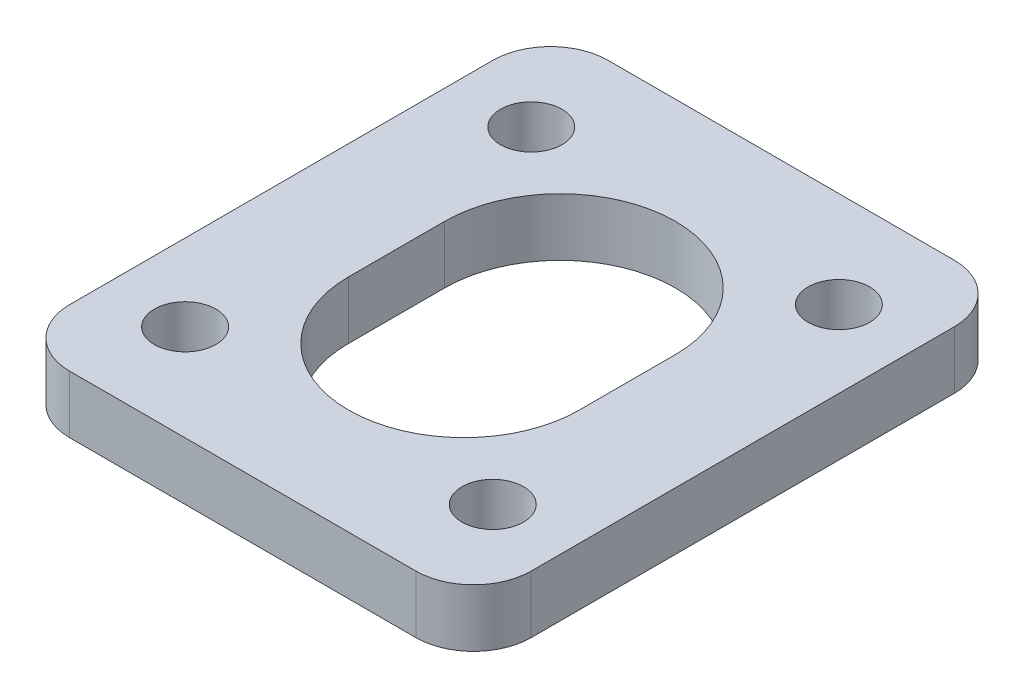
ISO-10303-21;
HEADER;
FILE_DESCRIPTION(('STEP AP214'),'2;1');
FILE_NAME('part.step','',(''),(''),'','','');
FILE_SCHEMA(('AUTOMOTIVE_DESIGN { 1 0 10303 214 1 1 1 1 }'));
ENDSEC;
DATA;
#1=APPLICATION_CONTEXT('core data for automotive mechanical design processes');
#2=APPLICATION_PROTOCOL_DEFINITION('international standard','automotive_design',2000,#1);
#3=PRODUCT_CONTEXT('',#1,'mechanical');
#4=PRODUCT('Part','Part','',(#3));
#5=PRODUCT_RELATED_PRODUCT_CATEGORY('part','',(#4));
#6=PRODUCT_DEFINITION_FORMATION('','',#4);
#7=PRODUCT_DEFINITION_CONTEXT('part definition',#1,'design');
#8=PRODUCT_DEFINITION('design','',#6,#7);
#9=PRODUCT_DEFINITION_SHAPE('','',#8);
#10=(LENGTH_UNIT() NAMED_UNIT(*) SI_UNIT(.MILLI.,.METRE.));
#11=(NAMED_UNIT(*) PLANE_ANGLE_UNIT() SI_UNIT($,.RADIAN.));
#12=(NAMED_UNIT(*) SI_UNIT($,.STERADIAN.) SOLID_ANGLE_UNIT());
#13=UNCERTAINTY_MEASURE_WITH_UNIT(LENGTH_MEASURE(1.E-05),#10,'distance_accuracy_value','');
#14=(GEOMETRIC_REPRESENTATION_CONTEXT(3) GLOBAL_UNCERTAINTY_ASSIGNED_CONTEXT((#13)) GLOBAL_UNIT_ASSIGNED_CONTEXT((#10,
#11,#12)) REPRESENTATION_CONTEXT('',''));
#15=CARTESIAN_POINT('',(0.,0.,0.));
#16=DIRECTION('',(0.,0.,1.));
#17=DIRECTION('',(1.,0.,0.));
#18=AXIS2_PLACEMENT_3D('',#15,#16,#17);
#19=CARTESIAN_POINT('',(0.,3.,0.));
#20=DIRECTION('',(0.,1.,0.));
#21=DIRECTION('',(0.,0.,1.));
#22=AXIS2_PLACEMENT_3D('',#19,#20,#21);
#23=PLANE('',#22);
#24=CARTESIAN_POINT('',(-8.,3.,-9.));
#25=DIRECTION('',(0.,1.,0.));
#26=DIRECTION('',(0.,0.,1.));
#27=AXIS2_PLACEMENT_3D('',#24,#25,#26);
#28=CIRCLE('',#27,1.6);
#29=CARTESIAN_POINT('',(-8.,3.,-7.4));
#30=VERTEX_POINT('',#29);
#31=EDGE_CURVE('E176',#30,#30,#28,.T.);
#32=ORIENTED_EDGE('',*,*,#31,.F.);
#33=EDGE_LOOP('',(#32));
#34=FACE_BOUND('',#33,.T.);
#35=CARTESIAN_POINT('',(8.,3.,9.));
#36=DIRECTION('',(0.,1.,0.));
#37=DIRECTION('',(0.,0.,1.));
#38=AXIS2_PLACEMENT_3D('',#35,#36,#37);
#39=CIRCLE('',#38,1.6);
#40=CARTESIAN_POINT('',(8.,3.,10.6));
#41=VERTEX_POINT('',#40);
#42=EDGE_CURVE('E188',#41,#41,#39,.T.);
#43=ORIENTED_EDGE('',*,*,#42,.F.);
#44=EDGE_LOOP('',(#43));
#45=FACE_BOUND('',#44,.T.);
#46=DIRECTION('',(0.,0.,1.));
#47=VECTOR('',#46,1.);
#48=CARTESIAN_POINT('',(-12.,3.,-14.));
#49=LINE('',#48,#47);
#50=CARTESIAN_POINT('',(-12.,3.,-11.));
#51=VERTEX_POINT('',#50);
#52=CARTESIAN_POINT('',(-12.,3.,11.));
#53=VERTEX_POINT('',#52);
#54=EDGE_CURVE('E199',#51,#53,#49,.T.);
#55=ORIENTED_EDGE('',*,*,#54,.T.);
#56=CARTESIAN_POINT('',(-9.,3.,11.));
#57=DIRECTION('',(0.,1.,0.));
#58=DIRECTION('',(0.,0.,1.));
#59=AXIS2_PLACEMENT_3D('',#56,#57,#58);
#60=CIRCLE('',#59,3.);
#61=CARTESIAN_POINT('',(-9.,3.,14.));
#62=VERTEX_POINT('',#61);
#63=EDGE_CURVE('E237',#53,#62,#60,.T.);
#64=ORIENTED_EDGE('',*,*,#63,.T.);
#65=DIRECTION('',(1.,0.,0.));
#66=VECTOR('',#65,1.);
#67=CARTESIAN_POINT('',(-12.,3.,14.));
#68=LINE('',#67,#66);
#69=CARTESIAN_POINT('',(8.99999999999999,3.,14.));
#70=VERTEX_POINT('',#69);
#71=EDGE_CURVE('E202',#62,#70,#68,.T.);
#72=ORIENTED_EDGE('',*,*,#71,.T.);
#73=CARTESIAN_POINT('',(8.99999999999999,3.,11.));
#74=DIRECTION('',(0.,1.,0.));
#75=DIRECTION('',(0.,0.,1.));
#76=AXIS2_PLACEMENT_3D('',#73,#74,#75);
#77=CIRCLE('',#76,3.);
#78=CARTESIAN_POINT('',(12.,3.,11.));
#79=VERTEX_POINT('',#78);
#80=EDGE_CURVE('E232',#70,#79,#77,.T.);
#81=ORIENTED_EDGE('',*,*,#80,.T.);
#82=DIRECTION('',(0.,0.,-1.));
#83=VECTOR('',#82,1.);
#84=CARTESIAN_POINT('',(12.,3.,-14.));
#85=LINE('',#84,#83);
#86=CARTESIAN_POINT('',(12.,3.,-11.));
#87=VERTEX_POINT('',#86);
#88=EDGE_CURVE('E194',#79,#87,#85,.T.);
#89=ORIENTED_EDGE('',*,*,#88,.T.);
#90=CARTESIAN_POINT('',(8.99999999999999,3.,-11.));
#91=DIRECTION('',(0.,1.,0.));
#92=DIRECTION('',(0.,0.,1.));
#93=AXIS2_PLACEMENT_3D('',#90,#91,#92);
#94=CIRCLE('',#93,3.);
#95=CARTESIAN_POINT('',(8.99999999999999,3.,-14.));
#96=VERTEX_POINT('',#95);
#97=EDGE_CURVE('E60',#87,#96,#94,.T.);
#98=ORIENTED_EDGE('',*,*,#97,.T.);
#99=DIRECTION('',(-1.,0.,0.));
#100=VECTOR('',#99,1.);
#101=CARTESIAN_POINT('',(-12.,3.,-14.));
#102=LINE('',#101,#100);
#103=CARTESIAN_POINT('',(-9.,3.,-14.));
#104=VERTEX_POINT('',#103);
#105=EDGE_CURVE('E196',#96,#104,#102,.T.);
#106=ORIENTED_EDGE('',*,*,#105,.T.);
#107=CARTESIAN_POINT('',(-9.,3.,-11.));
#108=DIRECTION('',(0.,1.,0.));
#109=DIRECTION('',(0.,0.,1.));
#110=AXIS2_PLACEMENT_3D('',#107,#108,#109);
#111=CIRCLE('',#110,3.);
#112=EDGE_CURVE('E235',#104,#51,#111,.T.);
#113=ORIENTED_EDGE('',*,*,#112,.T.);
#114=EDGE_LOOP('',(#55,#64,#72,#81,#89,#98,#106,#113));
#115=FACE_BOUND('',#114,.T.);
#116=CARTESIAN_POINT('',(-8.,3.,9.));
#117=DIRECTION('',(0.,1.,0.));
#118=DIRECTION('',(0.,0.,1.));
#119=AXIS2_PLACEMENT_3D('',#116,#117,#118);
#120=CIRCLE('',#119,1.6);
#121=CARTESIAN_POINT('',(-8.,3.,10.6));
#122=VERTEX_POINT('',#121);
#123=EDGE_CURVE('E182',#122,#122,#120,.T.);
#124=ORIENTED_EDGE('',*,*,#123,.F.);
#125=EDGE_LOOP('',(#124));
#126=FACE_BOUND('',#125,.T.);
#127=CARTESIAN_POINT('',(8.,3.,-9.));
#128=DIRECTION('',(0.,1.,0.));
#129=DIRECTION('',(0.,0.,1.));
#130=AXIS2_PLACEMENT_3D('',#127,#128,#129);
#131=CIRCLE('',#130,1.6);
#132=CARTESIAN_POINT('',(8.,3.,-7.4));
#133=VERTEX_POINT('',#132);
#134=EDGE_CURVE('E170',#133,#133,#131,.T.);
#135=ORIENTED_EDGE('',*,*,#134,.F.);
#136=EDGE_LOOP('',(#135));
#137=FACE_BOUND('',#136,.T.);
#138=DIRECTION('',(0.,0.,1.));
#139=VECTOR('',#138,1.);
#140=CARTESIAN_POINT('',(-6.,3.,-2.5));
#141=LINE('',#140,#139);
#142=CARTESIAN_POINT('',(-6.,3.,-2.5));
#143=VERTEX_POINT('',#142);
#144=CARTESIAN_POINT('',(-6.,3.,2.5));
#145=VERTEX_POINT('',#144);
#146=EDGE_CURVE('E139',#143,#145,#141,.T.);
#147=ORIENTED_EDGE('',*,*,#146,.F.);
#148=CARTESIAN_POINT('',(0.,3.,-2.5));
#149=DIRECTION('',(0.,1.,0.));
#150=DIRECTION('',(0.,0.,1.));
#151=AXIS2_PLACEMENT_3D('',#148,#149,#150);
#152=CIRCLE('',#151,6.);
#153=CARTESIAN_POINT('',(6.,3.,-2.5));
#154=VERTEX_POINT('',#153);
#155=EDGE_CURVE('E129',#154,#143,#152,.T.);
#156=ORIENTED_EDGE('',*,*,#155,.F.);
#157=DIRECTION('',(0.,0.,-1.));
#158=VECTOR('',#157,1.);
#159=CARTESIAN_POINT('',(6.,3.,-2.5));
#160=LINE('',#159,#158);
#161=CARTESIAN_POINT('',(6.,3.,2.5));
#162=VERTEX_POINT('',#161);
#163=EDGE_CURVE('E154',#162,#154,#160,.T.);
#164=ORIENTED_EDGE('',*,*,#163,.F.);
#165=CARTESIAN_POINT('',(0.,3.,2.5));
#166=DIRECTION('',(0.,1.,0.));
#167=DIRECTION('',(0.,0.,1.));
#168=AXIS2_PLACEMENT_3D('',#165,#166,#167);
#169=CIRCLE('',#168,6.);
#170=EDGE_CURVE('E152',#145,#162,#169,.T.);
#171=ORIENTED_EDGE('',*,*,#170,.F.);
#172=EDGE_LOOP('',(#147,#156,#164,#171));
#173=FACE_BOUND('',#172,.T.);
#174=ADVANCED_FACE('F38',(#34,#45,#115,#126,#137,#173),#23,.T.);
#175=CARTESIAN_POINT('',(0.,0.,0.));
#176=DIRECTION('',(0.,1.,0.));
#177=DIRECTION('',(0.,0.,1.));
#178=AXIS2_PLACEMENT_3D('',#175,#176,#177);
#179=PLANE('',#178);
#180=CARTESIAN_POINT('',(8.,0.,-9.));
#181=DIRECTION('',(0.,1.,0.));
#182=DIRECTION('',(0.,0.,1.));
#183=AXIS2_PLACEMENT_3D('',#180,#181,#182);
#184=CIRCLE('',#183,1.6);
#185=CARTESIAN_POINT('',(8.,0.,-7.4));
#186=VERTEX_POINT('',#185);
#187=EDGE_CURVE('E147',#186,#186,#184,.T.);
#188=ORIENTED_EDGE('',*,*,#187,.T.);
#189=EDGE_LOOP('',(#188));
#190=FACE_BOUND('',#189,.T.);
#191=CARTESIAN_POINT('',(-8.,0.,-9.));
#192=DIRECTION('',(0.,1.,0.));
#193=DIRECTION('',(0.,0.,1.));
#194=AXIS2_PLACEMENT_3D('',#191,#192,#193);
#195=CIRCLE('',#194,1.6);
#196=CARTESIAN_POINT('',(-8.,0.,-7.4));
#197=VERTEX_POINT('',#196);
#198=EDGE_CURVE('E173',#197,#197,#195,.T.);
#199=ORIENTED_EDGE('',*,*,#198,.T.);
#200=EDGE_LOOP('',(#199));
#201=FACE_BOUND('',#200,.T.);
#202=CARTESIAN_POINT('',(-8.,0.,9.));
#203=DIRECTION('',(0.,1.,0.));
#204=DIRECTION('',(0.,0.,1.));
#205=AXIS2_PLACEMENT_3D('',#202,#203,#204);
#206=CIRCLE('',#205,1.6);
#207=CARTESIAN_POINT('',(-8.,0.,10.6));
#208=VERTEX_POINT('',#207);
#209=EDGE_CURVE('E179',#208,#208,#206,.T.);
#210=ORIENTED_EDGE('',*,*,#209,.T.);
#211=EDGE_LOOP('',(#210));
#212=FACE_BOUND('',#211,.T.);
#213=CARTESIAN_POINT('',(8.,0.,9.));
#214=DIRECTION('',(0.,1.,0.));
#215=DIRECTION('',(0.,0.,1.));
#216=AXIS2_PLACEMENT_3D('',#213,#214,#215);
#217=CIRCLE('',#216,1.6);
#218=CARTESIAN_POINT('',(8.,0.,10.6));
#219=VERTEX_POINT('',#218);
#220=EDGE_CURVE('E185',#219,#219,#217,.T.);
#221=ORIENTED_EDGE('',*,*,#220,.T.);
#222=EDGE_LOOP('',(#221));
#223=FACE_BOUND('',#222,.T.);
#224=DIRECTION('',(1.,0.,0.));
#225=VECTOR('',#224,1.);
#226=CARTESIAN_POINT('',(-12.,0.,14.));
#227=LINE('',#226,#225);
#228=CARTESIAN_POINT('',(-9.,0.,14.));
#229=VERTEX_POINT('',#228);
#230=CARTESIAN_POINT('',(8.99999999999999,0.,14.));
#231=VERTEX_POINT('',#230);
#232=EDGE_CURVE('E197',#229,#231,#227,.T.);
#233=ORIENTED_EDGE('',*,*,#232,.F.);
#234=CARTESIAN_POINT('',(-9.,0.,11.));
#235=DIRECTION('',(0.,1.,0.));
#236=DIRECTION('',(0.,0.,1.));
#237=AXIS2_PLACEMENT_3D('',#234,#235,#236);
#238=CIRCLE('',#237,3.);
#239=CARTESIAN_POINT('',(-12.,0.,11.));
#240=VERTEX_POINT('',#239);
#241=EDGE_CURVE('E225',#229,#240,#238,.F.);
#242=ORIENTED_EDGE('',*,*,#241,.T.);
#243=DIRECTION('',(0.,0.,1.));
#244=VECTOR('',#243,1.);
#245=CARTESIAN_POINT('',(-12.,0.,-14.));
#246=LINE('',#245,#244);
#247=CARTESIAN_POINT('',(-12.,0.,-11.));
#248=VERTEX_POINT('',#247);
#249=EDGE_CURVE('E210',#248,#240,#246,.T.);
#250=ORIENTED_EDGE('',*,*,#249,.F.);
#251=CARTESIAN_POINT('',(-9.,0.,-11.));
#252=DIRECTION('',(0.,1.,0.));
#253=DIRECTION('',(0.,0.,1.));
#254=AXIS2_PLACEMENT_3D('',#251,#252,#253);
#255=CIRCLE('',#254,3.);
#256=CARTESIAN_POINT('',(-9.,0.,-14.));
#257=VERTEX_POINT('',#256);
#258=EDGE_CURVE('E223',#248,#257,#255,.F.);
#259=ORIENTED_EDGE('',*,*,#258,.T.);
#260=DIRECTION('',(-1.,0.,0.));
#261=VECTOR('',#260,1.);
#262=CARTESIAN_POINT('',(-12.,0.,-14.));
#263=LINE('',#262,#261);
#264=CARTESIAN_POINT('',(8.99999999999999,0.,-14.));
#265=VERTEX_POINT('',#264);
#266=EDGE_CURVE('E208',#265,#257,#263,.T.);
#267=ORIENTED_EDGE('',*,*,#266,.F.);
#268=CARTESIAN_POINT('',(8.99999999999999,0.,-11.));
#269=DIRECTION('',(0.,1.,0.));
#270=DIRECTION('',(0.,0.,1.));
#271=AXIS2_PLACEMENT_3D('',#268,#269,#270);
#272=CIRCLE('',#271,3.);
#273=CARTESIAN_POINT('',(12.,0.,-11.));
#274=VERTEX_POINT('',#273);
#275=EDGE_CURVE('E221',#265,#274,#272,.F.);
#276=ORIENTED_EDGE('',*,*,#275,.T.);
#277=DIRECTION('',(0.,0.,-1.));
#278=VECTOR('',#277,1.);
#279=CARTESIAN_POINT('',(12.,0.,-14.));
#280=LINE('',#279,#278);
#281=CARTESIAN_POINT('',(12.,0.,11.));
#282=VERTEX_POINT('',#281);
#283=EDGE_CURVE('E191',#282,#274,#280,.T.);
#284=ORIENTED_EDGE('',*,*,#283,.F.);
#285=CARTESIAN_POINT('',(8.99999999999999,0.,11.));
#286=DIRECTION('',(0.,1.,0.));
#287=DIRECTION('',(0.,0.,1.));
#288=AXIS2_PLACEMENT_3D('',#285,#286,#287);
#289=CIRCLE('',#288,3.);
#290=EDGE_CURVE('E219',#282,#231,#289,.F.);
#291=ORIENTED_EDGE('',*,*,#290,.T.);
#292=EDGE_LOOP('',(#233,#242,#250,#259,#267,#276,#284,#291));
#293=FACE_BOUND('',#292,.T.);
#294=CARTESIAN_POINT('',(0.,0.,-2.5));
#295=DIRECTION('',(0.,1.,0.));
#296=DIRECTION('',(0.,0.,1.));
#297=AXIS2_PLACEMENT_3D('',#294,#295,#296);
#298=CIRCLE('',#297,6.);
#299=CARTESIAN_POINT('',(6.,0.,-2.5));
#300=VERTEX_POINT('',#299);
#301=CARTESIAN_POINT('',(-6.,0.,-2.5));
#302=VERTEX_POINT('',#301);
#303=EDGE_CURVE('E158',#300,#302,#298,.T.);
#304=ORIENTED_EDGE('',*,*,#303,.T.);
#305=DIRECTION('',(0.,0.,1.));
#306=VECTOR('',#305,1.);
#307=CARTESIAN_POINT('',(-6.,0.,-2.5));
#308=LINE('',#307,#306);
#309=CARTESIAN_POINT('',(-6.,0.,2.5));
#310=VERTEX_POINT('',#309);
#311=EDGE_CURVE('E146',#302,#310,#308,.T.);
#312=ORIENTED_EDGE('',*,*,#311,.T.);
#313=CARTESIAN_POINT('',(0.,0.,2.5));
#314=DIRECTION('',(0.,1.,0.));
#315=DIRECTION('',(0.,0.,1.));
#316=AXIS2_PLACEMENT_3D('',#313,#314,#315);
#317=CIRCLE('',#316,6.);
#318=CARTESIAN_POINT('',(6.,0.,2.5));
#319=VERTEX_POINT('',#318);
#320=EDGE_CURVE('E161',#310,#319,#317,.T.);
#321=ORIENTED_EDGE('',*,*,#320,.T.);
#322=DIRECTION('',(0.,0.,-1.));
#323=VECTOR('',#322,1.);
#324=CARTESIAN_POINT('',(6.,0.,-2.5));
#325=LINE('',#324,#323);
#326=EDGE_CURVE('E140',#319,#300,#325,.T.);
#327=ORIENTED_EDGE('',*,*,#326,.T.);
#328=EDGE_LOOP('',(#304,#312,#321,#327));
#329=FACE_BOUND('',#328,.T.);
#330=ADVANCED_FACE('F253',(#190,#201,#212,#223,#293,#329),#179,.F.);
#331=CARTESIAN_POINT('',(12.,3.,-14.));
#332=DIRECTION('',(-1.,0.,0.));
#333=DIRECTION('',(0.,0.,1.));
#334=AXIS2_PLACEMENT_3D('',#331,#332,#333);
#335=PLANE('',#334);
#336=ORIENTED_EDGE('',*,*,#283,.T.);
#337=DIRECTION('',(0.,-1.,0.));
#338=VECTOR('',#337,1.);
#339=CARTESIAN_POINT('',(12.,3.,-11.));
#340=LINE('',#339,#338);
#341=EDGE_CURVE('E11',#274,#87,#340,.F.);
#342=ORIENTED_EDGE('',*,*,#341,.T.);
#343=ORIENTED_EDGE('',*,*,#88,.F.);
#344=DIRECTION('',(0.,-1.,0.));
#345=VECTOR('',#344,1.);
#346=CARTESIAN_POINT('',(12.,3.,11.));
#347=LINE('',#346,#345);
#348=EDGE_CURVE('E46',#79,#282,#347,.T.);
#349=ORIENTED_EDGE('',*,*,#348,.T.);
#350=EDGE_LOOP('',(#336,#342,#343,#349));
#351=FACE_BOUND('',#350,.T.);
#352=ADVANCED_FACE('F247',(#351),#335,.F.);
#353=CARTESIAN_POINT('',(-12.,3.,-14.));
#354=DIRECTION('',(0.,0.,1.));
#355=DIRECTION('',(1.,0.,0.));
#356=AXIS2_PLACEMENT_3D('',#353,#354,#355);
#357=PLANE('',#356);
#358=ORIENTED_EDGE('',*,*,#266,.T.);
#359=DIRECTION('',(0.,-1.,0.));
#360=VECTOR('',#359,1.);
#361=CARTESIAN_POINT('',(-9.,3.,-14.));
#362=LINE('',#361,#360);
#363=EDGE_CURVE('E53',#257,#104,#362,.F.);
#364=ORIENTED_EDGE('',*,*,#363,.T.);
#365=ORIENTED_EDGE('',*,*,#105,.F.);
#366=DIRECTION('',(0.,-1.,0.));
#367=VECTOR('',#366,1.);
#368=CARTESIAN_POINT('',(8.99999999999999,3.,-14.));
#369=LINE('',#368,#367);
#370=EDGE_CURVE('E239',#96,#265,#369,.T.);
#371=ORIENTED_EDGE('',*,*,#370,.T.);
#372=EDGE_LOOP('',(#358,#364,#365,#371));
#373=FACE_BOUND('',#372,.T.);
#374=ADVANCED_FACE('F259',(#373),#357,.F.);
#375=CARTESIAN_POINT('',(-12.,3.,-14.));
#376=DIRECTION('',(1.,0.,0.));
#377=DIRECTION('',(0.,0.,-1.));
#378=AXIS2_PLACEMENT_3D('',#375,#376,#377);
#379=PLANE('',#378);
#380=ORIENTED_EDGE('',*,*,#249,.T.);
#381=DIRECTION('',(0.,-1.,0.));
#382=VECTOR('',#381,1.);
#383=CARTESIAN_POINT('',(-12.,3.,11.));
#384=LINE('',#383,#382);
#385=EDGE_CURVE('E230',#240,#53,#384,.F.);
#386=ORIENTED_EDGE('',*,*,#385,.T.);
#387=ORIENTED_EDGE('',*,*,#54,.F.);
#388=DIRECTION('',(0.,-1.,0.));
#389=VECTOR('',#388,1.);
#390=CARTESIAN_POINT('',(-12.,3.,-11.));
#391=LINE('',#390,#389);
#392=EDGE_CURVE('E227',#51,#248,#391,.T.);
#393=ORIENTED_EDGE('',*,*,#392,.T.);
#394=EDGE_LOOP('',(#380,#386,#387,#393));
#395=FACE_BOUND('',#394,.T.);
#396=ADVANCED_FACE('F268',(#395),#379,.F.);
#397=CARTESIAN_POINT('',(-12.,3.,14.));
#398=DIRECTION('',(0.,0.,-1.));
#399=DIRECTION('',(-1.,0.,0.));
#400=AXIS2_PLACEMENT_3D('',#397,#398,#399);
#401=PLANE('',#400);
#402=ORIENTED_EDGE('',*,*,#71,.F.);
#403=DIRECTION('',(0.,-1.,0.));
#404=VECTOR('',#403,1.);
#405=CARTESIAN_POINT('',(-9.,3.,14.));
#406=LINE('',#405,#404);
#407=EDGE_CURVE('E216',#62,#229,#406,.T.);
#408=ORIENTED_EDGE('',*,*,#407,.T.);
#409=ORIENTED_EDGE('',*,*,#232,.T.);
#410=DIRECTION('',(0.,-1.,0.));
#411=VECTOR('',#410,1.);
#412=CARTESIAN_POINT('',(8.99999999999999,3.,14.));
#413=LINE('',#412,#411);
#414=EDGE_CURVE('E205',#231,#70,#413,.F.);
#415=ORIENTED_EDGE('',*,*,#414,.T.);
#416=EDGE_LOOP('',(#402,#408,#409,#415));
#417=FACE_BOUND('',#416,.T.);
#418=ADVANCED_FACE('F276',(#417),#401,.F.);
#419=CARTESIAN_POINT('',(8.,3.,9.));
#420=DIRECTION('',(0.,-1.,0.));
#421=DIRECTION('',(0.,0.,-1.));
#422=AXIS2_PLACEMENT_3D('',#419,#420,#421);
#423=CYLINDRICAL_SURFACE('',#422,1.6);
#424=ORIENTED_EDGE('',*,*,#42,.T.);
#425=EDGE_LOOP('',(#424));
#426=FACE_BOUND('',#425,.T.);
#427=ORIENTED_EDGE('',*,*,#220,.F.);
#428=EDGE_LOOP('',(#427));
#429=FACE_BOUND('',#428,.T.);
#430=ADVANCED_FACE('F293',(#426,#429),#423,.F.);
#431=CARTESIAN_POINT('',(-8.,3.,9.));
#432=DIRECTION('',(0.,-1.,0.));
#433=DIRECTION('',(0.,0.,-1.));
#434=AXIS2_PLACEMENT_3D('',#431,#432,#433);
#435=CYLINDRICAL_SURFACE('',#434,1.6);
#436=ORIENTED_EDGE('',*,*,#123,.T.);
#437=EDGE_LOOP('',(#436));
#438=FACE_BOUND('',#437,.T.);
#439=ORIENTED_EDGE('',*,*,#209,.F.);
#440=EDGE_LOOP('',(#439));
#441=FACE_BOUND('',#440,.T.);
#442=ADVANCED_FACE('F388',(#438,#441),#435,.F.);
#443=CARTESIAN_POINT('',(-8.,3.,-9.));
#444=DIRECTION('',(0.,-1.,0.));
#445=DIRECTION('',(0.,0.,-1.));
#446=AXIS2_PLACEMENT_3D('',#443,#444,#445);
#447=CYLINDRICAL_SURFACE('',#446,1.6);
#448=ORIENTED_EDGE('',*,*,#31,.T.);
#449=EDGE_LOOP('',(#448));
#450=FACE_BOUND('',#449,.T.);
#451=ORIENTED_EDGE('',*,*,#198,.F.);
#452=EDGE_LOOP('',(#451));
#453=FACE_BOUND('',#452,.T.);
#454=ADVANCED_FACE('F378',(#450,#453),#447,.F.);
#455=CARTESIAN_POINT('',(8.,3.,-9.));
#456=DIRECTION('',(0.,-1.,0.));
#457=DIRECTION('',(0.,0.,-1.));
#458=AXIS2_PLACEMENT_3D('',#455,#456,#457);
#459=CYLINDRICAL_SURFACE('',#458,1.6);
#460=ORIENTED_EDGE('',*,*,#134,.T.);
#461=EDGE_LOOP('',(#460));
#462=FACE_BOUND('',#461,.T.);
#463=ORIENTED_EDGE('',*,*,#187,.F.);
#464=EDGE_LOOP('',(#463));
#465=FACE_BOUND('',#464,.T.);
#466=ADVANCED_FACE('F369',(#462,#465),#459,.F.);
#467=CARTESIAN_POINT('',(0.,3.,-2.5));
#468=DIRECTION('',(0.,-1.,0.));
#469=DIRECTION('',(0.,0.,-1.));
#470=AXIS2_PLACEMENT_3D('',#467,#468,#469);
#471=CYLINDRICAL_SURFACE('',#470,6.);
#472=ORIENTED_EDGE('',*,*,#303,.F.);
#473=DIRECTION('',(0.,-1.,0.));
#474=VECTOR('',#473,1.);
#475=CARTESIAN_POINT('',(6.,3.,-2.5));
#476=LINE('',#475,#474);
#477=EDGE_CURVE('E135',#154,#300,#476,.T.);
#478=ORIENTED_EDGE('',*,*,#477,.F.);
#479=ORIENTED_EDGE('',*,*,#155,.T.);
#480=DIRECTION('',(0.,-1.,0.));
#481=VECTOR('',#480,1.);
#482=CARTESIAN_POINT('',(-6.,3.,-2.5));
#483=LINE('',#482,#481);
#484=EDGE_CURVE('E132',#143,#302,#483,.T.);
#485=ORIENTED_EDGE('',*,*,#484,.T.);
#486=EDGE_LOOP('',(#472,#478,#479,#485));
#487=FACE_BOUND('',#486,.T.);
#488=ADVANCED_FACE('F131',(#487),#471,.F.);
#489=CARTESIAN_POINT('',(-6.,3.,-2.5));
#490=DIRECTION('',(1.,0.,0.));
#491=DIRECTION('',(0.,0.,-1.));
#492=AXIS2_PLACEMENT_3D('',#489,#490,#491);
#493=PLANE('',#492);
#494=ORIENTED_EDGE('',*,*,#311,.F.);
#495=ORIENTED_EDGE('',*,*,#484,.F.);
#496=ORIENTED_EDGE('',*,*,#146,.T.);
#497=DIRECTION('',(0.,-1.,0.));
#498=VECTOR('',#497,1.);
#499=CARTESIAN_POINT('',(-6.,3.,2.5));
#500=LINE('',#499,#498);
#501=EDGE_CURVE('E148',#145,#310,#500,.T.);
#502=ORIENTED_EDGE('',*,*,#501,.T.);
#503=EDGE_LOOP('',(#494,#495,#496,#502));
#504=FACE_BOUND('',#503,.T.);
#505=ADVANCED_FACE('F143',(#504),#493,.T.);
#506=CARTESIAN_POINT('',(0.,3.,2.5));
#507=DIRECTION('',(0.,-1.,0.));
#508=DIRECTION('',(0.,0.,-1.));
#509=AXIS2_PLACEMENT_3D('',#506,#507,#508);
#510=CYLINDRICAL_SURFACE('',#509,6.);
#511=ORIENTED_EDGE('',*,*,#320,.F.);
#512=ORIENTED_EDGE('',*,*,#501,.F.);
#513=ORIENTED_EDGE('',*,*,#170,.T.);
#514=DIRECTION('',(0.,-1.,0.));
#515=VECTOR('',#514,1.);
#516=CARTESIAN_POINT('',(6.,3.,2.5));
#517=LINE('',#516,#515);
#518=EDGE_CURVE('E167',#162,#319,#517,.T.);
#519=ORIENTED_EDGE('',*,*,#518,.T.);
#520=EDGE_LOOP('',(#511,#512,#513,#519));
#521=FACE_BOUND('',#520,.T.);
#522=ADVANCED_FACE('F342',(#521),#510,.F.);
#523=CARTESIAN_POINT('',(6.,3.,-2.5));
#524=DIRECTION('',(-1.,0.,0.));
#525=DIRECTION('',(0.,0.,1.));
#526=AXIS2_PLACEMENT_3D('',#523,#524,#525);
#527=PLANE('',#526);
#528=ORIENTED_EDGE('',*,*,#326,.F.);
#529=ORIENTED_EDGE('',*,*,#518,.F.);
#530=ORIENTED_EDGE('',*,*,#163,.T.);
#531=ORIENTED_EDGE('',*,*,#477,.T.);
#532=EDGE_LOOP('',(#528,#529,#530,#531));
#533=FACE_BOUND('',#532,.T.);
#534=ADVANCED_FACE('F306',(#533),#527,.T.);
#535=CARTESIAN_POINT('',(-9.,3.,11.));
#536=DIRECTION('',(0.,-1.,0.));
#537=DIRECTION('',(0.,0.,-1.));
#538=AXIS2_PLACEMENT_3D('',#535,#536,#537);
#539=CYLINDRICAL_SURFACE('',#538,3.);
#540=ORIENTED_EDGE('',*,*,#63,.F.);
#541=ORIENTED_EDGE('',*,*,#385,.F.);
#542=ORIENTED_EDGE('',*,*,#241,.F.);
#543=ORIENTED_EDGE('',*,*,#407,.F.);
#544=EDGE_LOOP('',(#540,#541,#542,#543));
#545=FACE_BOUND('',#544,.T.);
#546=ADVANCED_FACE('F273',(#545),#539,.T.);
#547=CARTESIAN_POINT('',(-9.,3.,-11.));
#548=DIRECTION('',(0.,-1.,0.));
#549=DIRECTION('',(0.,0.,-1.));
#550=AXIS2_PLACEMENT_3D('',#547,#548,#549);
#551=CYLINDRICAL_SURFACE('',#550,3.);
#552=ORIENTED_EDGE('',*,*,#112,.F.);
#553=ORIENTED_EDGE('',*,*,#363,.F.);
#554=ORIENTED_EDGE('',*,*,#258,.F.);
#555=ORIENTED_EDGE('',*,*,#392,.F.);
#556=EDGE_LOOP('',(#552,#553,#554,#555));
#557=FACE_BOUND('',#556,.T.);
#558=ADVANCED_FACE('F265',(#557),#551,.T.);
#559=CARTESIAN_POINT('',(8.99999999999999,3.,-11.));
#560=DIRECTION('',(0.,-1.,0.));
#561=DIRECTION('',(0.,0.,-1.));
#562=AXIS2_PLACEMENT_3D('',#559,#560,#561);
#563=CYLINDRICAL_SURFACE('',#562,3.);
#564=ORIENTED_EDGE('',*,*,#97,.F.);
#565=ORIENTED_EDGE('',*,*,#341,.F.);
#566=ORIENTED_EDGE('',*,*,#275,.F.);
#567=ORIENTED_EDGE('',*,*,#370,.F.);
#568=EDGE_LOOP('',(#564,#565,#566,#567));
#569=FACE_BOUND('',#568,.T.);
#570=ADVANCED_FACE('F258',(#569),#563,.T.);
#571=CARTESIAN_POINT('',(8.99999999999999,3.,11.));
#572=DIRECTION('',(0.,-1.,0.));
#573=DIRECTION('',(0.,0.,-1.));
#574=AXIS2_PLACEMENT_3D('',#571,#572,#573);
#575=CYLINDRICAL_SURFACE('',#574,3.);
#576=ORIENTED_EDGE('',*,*,#80,.F.);
#577=ORIENTED_EDGE('',*,*,#414,.F.);
#578=ORIENTED_EDGE('',*,*,#290,.F.);
#579=ORIENTED_EDGE('',*,*,#348,.F.);
#580=EDGE_LOOP('',(#576,#577,#578,#579));
#581=FACE_BOUND('',#580,.T.);
#582=ADVANCED_FACE('F40',(#581),#575,.T.);
#583=CLOSED_SHELL('',(#174,#330,#352,#374,#396,#418,#430,#442,#454,#466,#488,#505,#522,#534,
#546,#558,#570,#582));
#584=MANIFOLD_SOLID_BREP('B2',#583);
#585=ADVANCED_BREP_SHAPE_REPRESENTATION('',(#18,#584),#14);
#586=SHAPE_DEFINITION_REPRESENTATION(#9,#585);
ENDSEC;
END-ISO-10303-21;
